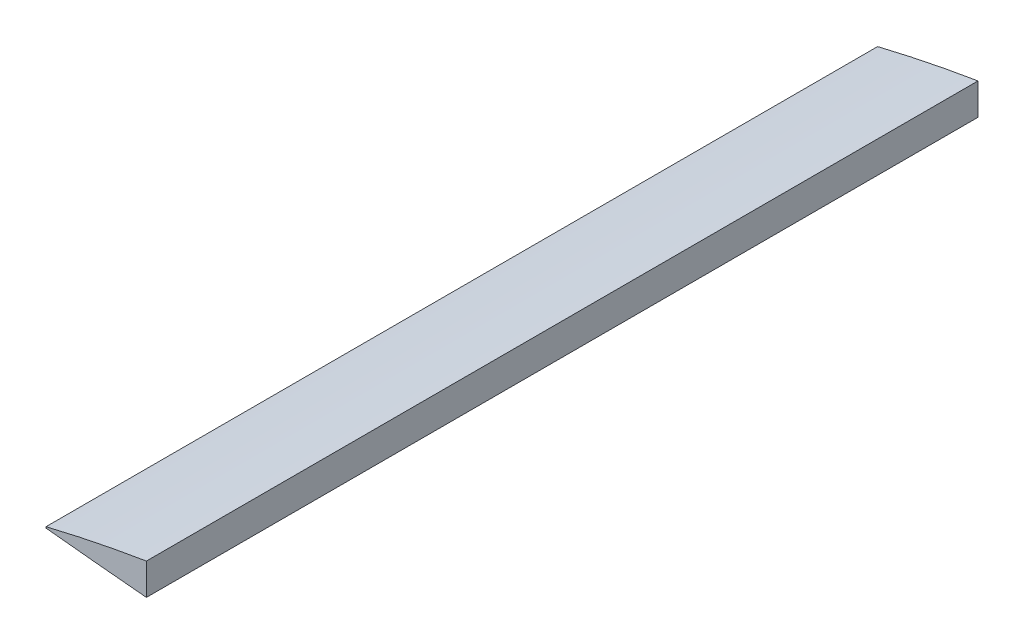
ISO-10303-21;
HEADER;
FILE_DESCRIPTION(('STEP AP214'),'2;1');
FILE_NAME('part.step','',(''),(''),'','','');
FILE_SCHEMA(('AUTOMOTIVE_DESIGN { 1 0 10303 214 1 1 1 1 }'));
ENDSEC;
DATA;
#1=APPLICATION_CONTEXT('core data for automotive mechanical design processes');
#2=APPLICATION_PROTOCOL_DEFINITION('international standard','automotive_design',2000,#1);
#3=PRODUCT_CONTEXT('',#1,'mechanical');
#4=PRODUCT('Part','Part','',(#3));
#5=PRODUCT_RELATED_PRODUCT_CATEGORY('part','',(#4));
#6=PRODUCT_DEFINITION_FORMATION('','',#4);
#7=PRODUCT_DEFINITION_CONTEXT('part definition',#1,'design');
#8=PRODUCT_DEFINITION('design','',#6,#7);
#9=PRODUCT_DEFINITION_SHAPE('','',#8);
#10=(LENGTH_UNIT() NAMED_UNIT(*) SI_UNIT(.MILLI.,.METRE.));
#11=(NAMED_UNIT(*) PLANE_ANGLE_UNIT() SI_UNIT($,.RADIAN.));
#12=(NAMED_UNIT(*) SI_UNIT($,.STERADIAN.) SOLID_ANGLE_UNIT());
#13=UNCERTAINTY_MEASURE_WITH_UNIT(LENGTH_MEASURE(1.E-05),#10,'distance_accuracy_value','');
#14=(GEOMETRIC_REPRESENTATION_CONTEXT(3) GLOBAL_UNCERTAINTY_ASSIGNED_CONTEXT((#13)) GLOBAL_UNIT_ASSIGNED_CONTEXT((#10,
#11,#12)) REPRESENTATION_CONTEXT('',''));
#15=CARTESIAN_POINT('',(0.,0.,0.));
#16=DIRECTION('',(0.,0.,1.));
#17=DIRECTION('',(1.,0.,0.));
#18=AXIS2_PLACEMENT_3D('',#15,#16,#17);
#19=CARTESIAN_POINT('',(-210.29024,15.5058314522249,-612.));
#20=CARTESIAN_POINT('',(-212.448163353275,15.1479340687311,-612.));
#21=CARTESIAN_POINT('',(-217.698820474475,14.2770984839323,-612.));
#22=CARTESIAN_POINT('',(-225.855056301461,12.8241428399332,-612.));
#23=CARTESIAN_POINT('',(-234.57385963361,11.2047682892585,-612.));
#24=CARTESIAN_POINT('',(-242.716368314428,9.61995396378064,-612.));
#25=CARTESIAN_POINT('',(-250.234652112608,8.09676921778001,-612.));
#26=CARTESIAN_POINT('',(-257.0840012335,6.6572410943926,-612.));
#27=CARTESIAN_POINT('',(-263.224123516304,5.32391997928555,-612.));
#28=CARTESIAN_POINT('',(-268.619097385422,4.11810915980885,-612.));
#29=CARTESIAN_POINT('',(-273.237578484398,3.05976006784548,-612.));
#30=CARTESIAN_POINT('',(-277.052897894547,2.16689109478463,-612.));
#31=CARTESIAN_POINT('',(-280.043162129704,1.45515688166644,-612.));
#32=CARTESIAN_POINT('',(-282.191276140311,0.937226777434344,-612.));
#33=CARTESIAN_POINT('',(-283.475130042903,0.625092250465188,-612.));
#34=CARTESIAN_POINT('',(-284.041595767765,0.486694399645982,-612.));
#35=CARTESIAN_POINT('',(-284.176,0.453857007963045,-612.));
#36=B_SPLINE_CURVE_WITH_KNOTS('',3,(#19,#20,#21,#22,#23,#24,#25,#26,#27,#28,#29,#30,#31,#32,#33,
#34,#35),.UNSPECIFIED.,.F.,.F.,(4,1,1,1,1,1,1,1,1,1,1,1,1,1,4),(0.,0.0870070051452901,
0.21170536500617,0.329527112719374,0.439740644540536,0.541660709078569,0.634652346186562,
0.718134668905483,0.791584505134145,0.854539888493236,0.906603358473801,0.947445002011979,
0.976805146454738,0.994496601743555,1.),.UNSPECIFIED.);
#37=DIRECTION('',(0.,0.,1.));
#38=VECTOR('',#37,1.);
#39=SURFACE_OF_LINEAR_EXTRUSION('',#36,#38);
#40=CARTESIAN_POINT('',(-210.29024,15.5058314522249,0.));
#41=CARTESIAN_POINT('',(-212.448163353275,15.1479340687311,0.));
#42=CARTESIAN_POINT('',(-217.698820474475,14.2770984839323,0.));
#43=CARTESIAN_POINT('',(-225.855056301461,12.8241428399332,0.));
#44=CARTESIAN_POINT('',(-234.57385963361,11.2047682892585,0.));
#45=CARTESIAN_POINT('',(-242.716368314428,9.61995396378064,0.));
#46=CARTESIAN_POINT('',(-250.234652112608,8.09676921778001,0.));
#47=CARTESIAN_POINT('',(-257.0840012335,6.6572410943926,0.));
#48=CARTESIAN_POINT('',(-263.224123516304,5.32391997928555,0.));
#49=CARTESIAN_POINT('',(-268.619097385422,4.11810915980885,0.));
#50=CARTESIAN_POINT('',(-273.237578484398,3.05976006784548,0.));
#51=CARTESIAN_POINT('',(-277.052897894547,2.16689109478463,0.));
#52=CARTESIAN_POINT('',(-280.043162129704,1.45515688166644,0.));
#53=CARTESIAN_POINT('',(-282.191276140311,0.937226777434344,0.));
#54=CARTESIAN_POINT('',(-283.475130042903,0.625092250465188,0.));
#55=CARTESIAN_POINT('',(-284.041595767765,0.486694399645982,0.));
#56=CARTESIAN_POINT('',(-284.176,0.453857007963045,0.));
#57=B_SPLINE_CURVE_WITH_KNOTS('',3,(#40,#41,#42,#43,#44,#45,#46,#47,#48,#49,#50,#51,#52,#53,#54,
#55,#56),.UNSPECIFIED.,.F.,.F.,(4,1,1,1,1,1,1,1,1,1,1,1,1,1,4),(0.,0.0870070051452901,
0.21170536500617,0.329527112719374,0.439740644540536,0.541660709078569,0.634652346186562,
0.718134668905483,0.791584505134145,0.854539888493236,0.906603358473801,0.947445002011979,
0.976805146454738,0.994496601743555,1.),.UNSPECIFIED.);
#58=CARTESIAN_POINT('',(-210.29024,15.5058314522249,0.));
#59=VERTEX_POINT('',#58);
#60=CARTESIAN_POINT('',(-284.176,0.453857007963045,0.));
#61=VERTEX_POINT('',#60);
#62=EDGE_CURVE('E133',#59,#61,#57,.T.);
#63=ORIENTED_EDGE('',*,*,#62,.F.);
#64=DIRECTION('',(0.,0.,1.));
#65=VECTOR('',#64,1.);
#66=CARTESIAN_POINT('',(-210.29024,15.5058314522249,-612.));
#67=LINE('',#66,#65);
#68=CARTESIAN_POINT('',(-210.29024,15.5058314522249,-612.));
#69=VERTEX_POINT('',#68);
#70=EDGE_CURVE('E65',#69,#59,#67,.T.);
#71=ORIENTED_EDGE('',*,*,#70,.F.);
#72=CARTESIAN_POINT('',(-284.176,0.453857007963045,-612.));
#73=VERTEX_POINT('',#72);
#74=EDGE_CURVE('E146',#69,#73,#36,.T.);
#75=ORIENTED_EDGE('',*,*,#74,.T.);
#76=DIRECTION('',(0.,0.,1.));
#77=VECTOR('',#76,1.);
#78=CARTESIAN_POINT('',(-284.176,0.453857007963045,-612.));
#79=LINE('',#78,#77);
#80=EDGE_CURVE('E91',#73,#61,#79,.T.);
#81=ORIENTED_EDGE('',*,*,#80,.T.);
#82=EDGE_LOOP('',(#63,#71,#75,#81));
#83=FACE_BOUND('',#82,.T.);
#84=ADVANCED_FACE('F39',(#83),#39,.T.);
#85=CARTESIAN_POINT('',(-210.29024,15.5058314522249,-612.));
#86=DIRECTION('',(1.,0.,0.));
#87=DIRECTION('',(0.,0.,-1.));
#88=AXIS2_PLACEMENT_3D('',#85,#86,#87);
#89=PLANE('',#88);
#90=DIRECTION('',(0.,1.,0.));
#91=VECTOR('',#90,1.);
#92=CARTESIAN_POINT('',(-210.29024,15.5058314522249,0.));
#93=LINE('',#92,#91);
#94=CARTESIAN_POINT('',(-210.29024,-7.68483164503255,0.));
#95=VERTEX_POINT('',#94);
#96=EDGE_CURVE('E152',#95,#59,#93,.T.);
#97=ORIENTED_EDGE('',*,*,#96,.F.);
#98=DIRECTION('',(0.,0.,1.));
#99=VECTOR('',#98,1.);
#100=CARTESIAN_POINT('',(-210.29024,-7.68483164503255,-612.));
#101=LINE('',#100,#99);
#102=CARTESIAN_POINT('',(-210.29024,-7.68483164503255,-612.));
#103=VERTEX_POINT('',#102);
#104=EDGE_CURVE('E204',#103,#95,#101,.T.);
#105=ORIENTED_EDGE('',*,*,#104,.F.);
#106=DIRECTION('',(0.,1.,0.));
#107=VECTOR('',#106,1.);
#108=CARTESIAN_POINT('',(-210.29024,15.5058314522249,-612.));
#109=LINE('',#108,#107);
#110=EDGE_CURVE('E163',#103,#69,#109,.T.);
#111=ORIENTED_EDGE('',*,*,#110,.T.);
#112=ORIENTED_EDGE('',*,*,#70,.T.);
#113=EDGE_LOOP('',(#97,#105,#111,#112));
#114=FACE_BOUND('',#113,.T.);
#115=ADVANCED_FACE('F173',(#114),#89,.T.);
#116=CARTESIAN_POINT('',(-284.176,-0.446585887155011,-612.));
#117=CARTESIAN_POINT('',(-284.166073983192,-0.446550556465792,-612.));
#118=CARTESIAN_POINT('',(-284.007600869438,-0.445986486865687,-612.));
#119=CARTESIAN_POINT('',(-283.409976300944,-0.546659804662299,-612.));
#120=CARTESIAN_POINT('',(-282.084971372146,-0.653321357836059,-612.));
#121=CARTESIAN_POINT('',(-279.890503933711,-0.906023665877273,-612.));
#122=CARTESIAN_POINT('',(-276.83669848881,-1.21907284104337,-612.));
#123=CARTESIAN_POINT('',(-272.945834405881,-1.6281931925168,-612.));
#124=CARTESIAN_POINT('',(-268.242600772352,-2.11178080190877,-612.));
#125=CARTESIAN_POINT('',(-262.758082865926,-2.67007960663762,-612.));
#126=CARTESIAN_POINT('',(-256.527861272268,-3.29477004091561,-612.));
#127=CARTESIAN_POINT('',(-249.592304466849,-3.98011450002054,-612.));
#128=CARTESIAN_POINT('',(-241.996045088026,-4.71925279025023,-612.));
#129=CARTESIAN_POINT('',(-233.787735511311,-5.50572775187703,-612.));
#130=CARTESIAN_POINT('',(-225.019553340548,-6.33168785215731,-612.));
#131=CARTESIAN_POINT('',(-217.124973788987,-7.06522307018421,-612.));
#132=CARTESIAN_POINT('',(-212.158655952302,-7.51544881591709,-612.));
#133=CARTESIAN_POINT('',(-210.29024,-7.68483164503255,-612.));
#134=B_SPLINE_CURVE_WITH_KNOTS('',3,(#116,#117,#118,#119,#120,#121,#122,#123,#124,#125,#126,
#127,#128,#129,#130,#131,#132,#133),.UNSPECIFIED.,.F.,.F.,(4,1,1,1,1,1,1,1,1,1,1,1,1,1,1,4),(0.,
0.000401027004237275,0.00640256804801398,0.0243667405419057,0.0541726551316402,
0.0956203448841406,0.148432949269866,0.212259606924723,0.286678920603446,0.371202853061501,
0.465280924763119,0.568304609739684,0.67961185947699,0.798491720853711,0.924189047970983,1.),.UNSPECIFIED.);
#135=DIRECTION('',(0.,0.,1.));
#136=VECTOR('',#135,1.);
#137=SURFACE_OF_LINEAR_EXTRUSION('',#134,#136);
#138=CARTESIAN_POINT('',(-284.176,-0.446585887155011,-83.8999999999999));
#139=CARTESIAN_POINT('',(-284.166073983192,-0.446550556465792,-83.8999999999999));
#140=CARTESIAN_POINT('',(-284.007600869438,-0.445986486865687,-83.8999999999999));
#141=CARTESIAN_POINT('',(-283.409976300944,-0.546659804662299,-83.8999999999999));
#142=CARTESIAN_POINT('',(-282.084971372146,-0.653321357836059,-83.8999999999999));
#143=CARTESIAN_POINT('',(-279.890503933711,-0.906023665877273,-83.8999999999999));
#144=CARTESIAN_POINT('',(-276.83669848881,-1.21907284104337,-83.8999999999999));
#145=CARTESIAN_POINT('',(-272.945834405881,-1.6281931925168,-83.8999999999999));
#146=CARTESIAN_POINT('',(-268.242600772352,-2.11178080190877,-83.8999999999999));
#147=CARTESIAN_POINT('',(-262.758082865926,-2.67007960663762,-83.8999999999999));
#148=CARTESIAN_POINT('',(-256.527861272268,-3.29477004091561,-83.8999999999999));
#149=CARTESIAN_POINT('',(-249.592304466849,-3.98011450002054,-83.8999999999999));
#150=CARTESIAN_POINT('',(-241.996045088026,-4.71925279025023,-83.8999999999999));
#151=CARTESIAN_POINT('',(-233.787735511311,-5.50572775187703,-83.8999999999999));
#152=CARTESIAN_POINT('',(-225.019553340548,-6.33168785215731,-83.8999999999999));
#153=CARTESIAN_POINT('',(-217.124973788987,-7.06522307018421,-83.8999999999999));
#154=CARTESIAN_POINT('',(-212.158655952302,-7.51544881591709,-83.8999999999999));
#155=CARTESIAN_POINT('',(-210.29024,-7.68483164503255,-83.8999999999999));
#156=B_SPLINE_CURVE_WITH_KNOTS('',3,(#138,#139,#140,#141,#142,#143,#144,#145,#146,#147,#148,
#149,#150,#151,#152,#153,#154,#155),.UNSPECIFIED.,.F.,.F.,(4,1,1,1,1,1,1,1,1,1,1,1,1,1,1,4),(0.,
0.000401027004237275,0.00640256804801398,0.0243667405419057,0.0541726551316402,
0.0956203448841406,0.148432949269866,0.212259606924723,0.286678920603446,0.371202853061501,
0.465280924763119,0.568304609739684,0.67961185947699,0.798491720853711,0.924189047970983,1.),.UNSPECIFIED.);
#157=CARTESIAN_POINT('',(-212.632,-7.47242156767323,-83.8999999999999));
#158=VERTEX_POINT('',#157);
#159=CARTESIAN_POINT('',(-233.632,-5.5182299496552,-83.8999999999999));
#160=VERTEX_POINT('',#159);
#161=EDGE_CURVE('E11',#158,#160,#156,.F.);
#162=ORIENTED_EDGE('',*,*,#161,.F.);
#163=DIRECTION('',(0.,0.,1.));
#164=VECTOR('',#163,1.);
#165=CARTESIAN_POINT('',(-212.632,-7.47242156767323,-612.));
#166=LINE('',#165,#164);
#167=CARTESIAN_POINT('',(-212.632,-7.47242156767323,-96.8999999999999));
#168=VERTEX_POINT('',#167);
#169=EDGE_CURVE('E121',#158,#168,#166,.F.);
#170=ORIENTED_EDGE('',*,*,#169,.T.);
#171=CARTESIAN_POINT('',(-284.176,-0.446585887155011,-96.9));
#172=CARTESIAN_POINT('',(-284.166073983192,-0.446550556465792,-96.9));
#173=CARTESIAN_POINT('',(-284.007600869438,-0.445986486865687,-96.9));
#174=CARTESIAN_POINT('',(-283.409976300944,-0.546659804662299,-96.9));
#175=CARTESIAN_POINT('',(-282.084971372146,-0.653321357836059,-96.9));
#176=CARTESIAN_POINT('',(-279.890503933711,-0.906023665877273,-96.9));
#177=CARTESIAN_POINT('',(-276.83669848881,-1.21907284104337,-96.9));
#178=CARTESIAN_POINT('',(-272.945834405881,-1.6281931925168,-96.9));
#179=CARTESIAN_POINT('',(-268.242600772352,-2.11178080190877,-96.9));
#180=CARTESIAN_POINT('',(-262.758082865926,-2.67007960663762,-96.9));
#181=CARTESIAN_POINT('',(-256.527861272268,-3.29477004091561,-96.9));
#182=CARTESIAN_POINT('',(-249.592304466849,-3.98011450002054,-96.9));
#183=CARTESIAN_POINT('',(-241.996045088026,-4.71925279025023,-96.9));
#184=CARTESIAN_POINT('',(-233.787735511311,-5.50572775187703,-96.9));
#185=CARTESIAN_POINT('',(-225.019553340548,-6.33168785215731,-96.9));
#186=CARTESIAN_POINT('',(-217.124973788987,-7.06522307018421,-96.9));
#187=CARTESIAN_POINT('',(-212.158655952302,-7.51544881591709,-96.9));
#188=CARTESIAN_POINT('',(-210.29024,-7.68483164503255,-96.9));
#189=B_SPLINE_CURVE_WITH_KNOTS('',3,(#171,#172,#173,#174,#175,#176,#177,#178,#179,#180,#181,
#182,#183,#184,#185,#186,#187,#188),.UNSPECIFIED.,.F.,.F.,(4,1,1,1,1,1,1,1,1,1,1,1,1,1,1,4),(0.,
0.000401027004237275,0.00640256804801398,0.0243667405419057,0.0541726551316402,
0.0956203448841406,0.148432949269866,0.212259606924723,0.286678920603446,0.371202853061501,
0.465280924763119,0.568304609739684,0.67961185947699,0.798491720853711,0.924189047970983,1.),.UNSPECIFIED.);
#190=CARTESIAN_POINT('',(-233.631999990573,-5.5182299496552,-96.9));
#191=VERTEX_POINT('',#190);
#192=EDGE_CURVE('E203',#168,#191,#189,.F.);
#193=ORIENTED_EDGE('',*,*,#192,.T.);
#194=DIRECTION('',(0.,0.,1.));
#195=VECTOR('',#194,1.);
#196=CARTESIAN_POINT('',(-233.632,-5.51822994875993,-612.));
#197=LINE('',#196,#195);
#198=EDGE_CURVE('E49',#191,#160,#197,.T.);
#199=ORIENTED_EDGE('',*,*,#198,.T.);
#200=EDGE_LOOP('',(#162,#170,#193,#199));
#201=FACE_BOUND('',#200,.T.);
#202=CARTESIAN_POINT('',(-284.176,-0.446585887155011,0.));
#203=CARTESIAN_POINT('',(-284.166073983192,-0.446550556465792,0.));
#204=CARTESIAN_POINT('',(-284.007600869438,-0.445986486865687,0.));
#205=CARTESIAN_POINT('',(-283.409976300944,-0.546659804662299,0.));
#206=CARTESIAN_POINT('',(-282.084971372146,-0.653321357836059,0.));
#207=CARTESIAN_POINT('',(-279.890503933711,-0.906023665877273,0.));
#208=CARTESIAN_POINT('',(-276.83669848881,-1.21907284104337,0.));
#209=CARTESIAN_POINT('',(-272.945834405881,-1.6281931925168,0.));
#210=CARTESIAN_POINT('',(-268.242600772352,-2.11178080190877,0.));
#211=CARTESIAN_POINT('',(-262.758082865926,-2.67007960663762,0.));
#212=CARTESIAN_POINT('',(-256.527861272268,-3.29477004091561,0.));
#213=CARTESIAN_POINT('',(-249.592304466849,-3.98011450002054,0.));
#214=CARTESIAN_POINT('',(-241.996045088026,-4.71925279025023,0.));
#215=CARTESIAN_POINT('',(-233.787735511311,-5.50572775187703,0.));
#216=CARTESIAN_POINT('',(-225.019553340548,-6.33168785215731,0.));
#217=CARTESIAN_POINT('',(-217.124973788987,-7.06522307018421,0.));
#218=CARTESIAN_POINT('',(-212.158655952302,-7.51544881591709,0.));
#219=CARTESIAN_POINT('',(-210.29024,-7.68483164503255,0.));
#220=B_SPLINE_CURVE_WITH_KNOTS('',3,(#202,#203,#204,#205,#206,#207,#208,#209,#210,#211,#212,
#213,#214,#215,#216,#217,#218,#219),.UNSPECIFIED.,.F.,.F.,(4,1,1,1,1,1,1,1,1,1,1,1,1,1,1,4),(0.,
0.000401027004237275,0.00640256804801398,0.0243667405419057,0.0541726551316402,
0.0956203448841406,0.148432949269866,0.212259606924723,0.286678920603446,0.371202853061501,
0.465280924763119,0.568304609739684,0.67961185947699,0.798491720853711,0.924189047970983,1.),.UNSPECIFIED.);
#221=CARTESIAN_POINT('',(-284.176,-0.446585887155011,0.));
#222=VERTEX_POINT('',#221);
#223=EDGE_CURVE('E195',#222,#95,#220,.T.);
#224=ORIENTED_EDGE('',*,*,#223,.F.);
#225=DIRECTION('',(0.,0.,1.));
#226=VECTOR('',#225,1.);
#227=CARTESIAN_POINT('',(-284.176,-0.446585887155011,-612.));
#228=LINE('',#227,#226);
#229=CARTESIAN_POINT('',(-284.176,-0.446585887155011,-612.));
#230=VERTEX_POINT('',#229);
#231=EDGE_CURVE('E206',#230,#222,#228,.T.);
#232=ORIENTED_EDGE('',*,*,#231,.F.);
#233=EDGE_CURVE('E157',#230,#103,#134,.T.);
#234=ORIENTED_EDGE('',*,*,#233,.T.);
#235=ORIENTED_EDGE('',*,*,#104,.T.);
#236=EDGE_LOOP('',(#224,#232,#234,#235));
#237=FACE_BOUND('',#236,.T.);
#238=ADVANCED_FACE('F169',(#201,#237),#137,.T.);
#239=CARTESIAN_POINT('',(-284.176,0.453857007963045,-612.));
#240=DIRECTION('',(-1.,0.,0.));
#241=DIRECTION('',(0.,0.,1.));
#242=AXIS2_PLACEMENT_3D('',#239,#240,#241);
#243=PLANE('',#242);
#244=DIRECTION('',(0.,-1.,0.));
#245=VECTOR('',#244,1.);
#246=CARTESIAN_POINT('',(-284.176,0.453857007963045,0.));
#247=LINE('',#246,#245);
#248=EDGE_CURVE('E192',#61,#222,#247,.T.);
#249=ORIENTED_EDGE('',*,*,#248,.F.);
#250=ORIENTED_EDGE('',*,*,#80,.F.);
#251=DIRECTION('',(0.,-1.,0.));
#252=VECTOR('',#251,1.);
#253=CARTESIAN_POINT('',(-284.176,0.453857007963045,-612.));
#254=LINE('',#253,#252);
#255=EDGE_CURVE('E151',#73,#230,#254,.T.);
#256=ORIENTED_EDGE('',*,*,#255,.T.);
#257=ORIENTED_EDGE('',*,*,#231,.T.);
#258=EDGE_LOOP('',(#249,#250,#256,#257));
#259=FACE_BOUND('',#258,.T.);
#260=ADVANCED_FACE('F172',(#259),#243,.T.);
#261=CARTESIAN_POINT('',(-247.374557249018,8.67350765840326,-612.));
#262=DIRECTION('',(0.,0.,-1.));
#263=DIRECTION('',(-1.,0.,0.));
#264=AXIS2_PLACEMENT_3D('',#261,#262,#263);
#265=PLANE('',#264);
#266=ORIENTED_EDGE('',*,*,#74,.F.);
#267=ORIENTED_EDGE('',*,*,#110,.F.);
#268=ORIENTED_EDGE('',*,*,#233,.F.);
#269=ORIENTED_EDGE('',*,*,#255,.F.);
#270=EDGE_LOOP('',(#266,#267,#268,#269));
#271=FACE_BOUND('',#270,.T.);
#272=ADVANCED_FACE('F177',(#271),#265,.T.);
#273=CARTESIAN_POINT('',(-247.374557249018,8.67350765840326,0.));
#274=DIRECTION('',(0.,0.,-1.));
#275=DIRECTION('',(-1.,0.,0.));
#276=AXIS2_PLACEMENT_3D('',#273,#274,#275);
#277=PLANE('',#276);
#278=ORIENTED_EDGE('',*,*,#62,.T.);
#279=ORIENTED_EDGE('',*,*,#248,.T.);
#280=ORIENTED_EDGE('',*,*,#223,.T.);
#281=ORIENTED_EDGE('',*,*,#96,.T.);
#282=EDGE_LOOP('',(#278,#279,#280,#281));
#283=FACE_BOUND('',#282,.T.);
#284=ADVANCED_FACE('F182',(#283),#277,.F.);
#285=CARTESIAN_POINT('',(-233.632,3.308,-83.8999999999999));
#286=DIRECTION('',(1.,0.,0.));
#287=DIRECTION('',(0.,0.,-1.));
#288=AXIS2_PLACEMENT_3D('',#285,#286,#287);
#289=PLANE('',#288);
#290=DIRECTION('',(0.,-1.,0.));
#291=VECTOR('',#290,1.);
#292=CARTESIAN_POINT('',(-233.632,3.308,-96.8999999999999));
#293=LINE('',#292,#291);
#294=CARTESIAN_POINT('',(-233.632,3.308,-96.8999999999999));
#295=VERTEX_POINT('',#294);
#296=EDGE_CURVE('E56',#295,#191,#293,.T.);
#297=ORIENTED_EDGE('',*,*,#296,.F.);
#298=DIRECTION('',(0.,0.,-1.));
#299=VECTOR('',#298,1.);
#300=CARTESIAN_POINT('',(-233.632,3.308,-83.8999999999999));
#301=LINE('',#300,#299);
#302=CARTESIAN_POINT('',(-233.632,3.308,-83.8999999999999));
#303=VERTEX_POINT('',#302);
#304=EDGE_CURVE('E134',#303,#295,#301,.T.);
#305=ORIENTED_EDGE('',*,*,#304,.F.);
#306=DIRECTION('',(0.,-1.,0.));
#307=VECTOR('',#306,1.);
#308=CARTESIAN_POINT('',(-233.632,3.308,-83.8999999999999));
#309=LINE('',#308,#307);
#310=EDGE_CURVE('E126',#303,#160,#309,.T.);
#311=ORIENTED_EDGE('',*,*,#310,.T.);
#312=ORIENTED_EDGE('',*,*,#198,.F.);
#313=EDGE_LOOP('',(#297,#305,#311,#312));
#314=FACE_BOUND('',#313,.T.);
#315=ADVANCED_FACE('F219',(#314),#289,.T.);
#316=CARTESIAN_POINT('',(-212.632,-8.192,-83.8999999999999));
#317=DIRECTION('',(-1.,0.,0.));
#318=DIRECTION('',(0.,0.,1.));
#319=AXIS2_PLACEMENT_3D('',#316,#317,#318);
#320=PLANE('',#319);
#321=DIRECTION('',(0.,1.,0.));
#322=VECTOR('',#321,1.);
#323=CARTESIAN_POINT('',(-212.632,-8.192,-83.8999999999999));
#324=LINE('',#323,#322);
#325=CARTESIAN_POINT('',(-212.632,3.308,-83.8999999999999));
#326=VERTEX_POINT('',#325);
#327=EDGE_CURVE('E114',#158,#326,#324,.T.);
#328=ORIENTED_EDGE('',*,*,#327,.T.);
#329=DIRECTION('',(0.,0.,-1.));
#330=VECTOR('',#329,1.);
#331=CARTESIAN_POINT('',(-212.632,3.308,-83.8999999999999));
#332=LINE('',#331,#330);
#333=CARTESIAN_POINT('',(-212.632,3.308,-96.8999999999999));
#334=VERTEX_POINT('',#333);
#335=EDGE_CURVE('E118',#326,#334,#332,.T.);
#336=ORIENTED_EDGE('',*,*,#335,.T.);
#337=DIRECTION('',(0.,1.,0.));
#338=VECTOR('',#337,1.);
#339=CARTESIAN_POINT('',(-212.632,-8.192,-96.8999999999999));
#340=LINE('',#339,#338);
#341=EDGE_CURVE('E144',#168,#334,#340,.T.);
#342=ORIENTED_EDGE('',*,*,#341,.F.);
#343=ORIENTED_EDGE('',*,*,#169,.F.);
#344=EDGE_LOOP('',(#328,#336,#342,#343));
#345=FACE_BOUND('',#344,.T.);
#346=ADVANCED_FACE('F116',(#345),#320,.T.);
#347=CARTESIAN_POINT('',(-212.632,3.308,-83.8999999999999));
#348=DIRECTION('',(0.,-1.,0.));
#349=DIRECTION('',(0.,0.,-1.));
#350=AXIS2_PLACEMENT_3D('',#347,#348,#349);
#351=PLANE('',#350);
#352=DIRECTION('',(-1.,0.,0.));
#353=VECTOR('',#352,1.);
#354=CARTESIAN_POINT('',(-212.632,3.308,-96.8999999999999));
#355=LINE('',#354,#353);
#356=EDGE_CURVE('E132',#334,#295,#355,.T.);
#357=ORIENTED_EDGE('',*,*,#356,.F.);
#358=ORIENTED_EDGE('',*,*,#335,.F.);
#359=DIRECTION('',(-1.,0.,0.));
#360=VECTOR('',#359,1.);
#361=CARTESIAN_POINT('',(-212.632,3.308,-83.8999999999999));
#362=LINE('',#361,#360);
#363=EDGE_CURVE('E125',#326,#303,#362,.T.);
#364=ORIENTED_EDGE('',*,*,#363,.T.);
#365=ORIENTED_EDGE('',*,*,#304,.T.);
#366=EDGE_LOOP('',(#357,#358,#364,#365));
#367=FACE_BOUND('',#366,.T.);
#368=ADVANCED_FACE('F129',(#367),#351,.T.);
#369=CARTESIAN_POINT('',(0.,0.,-83.8999999999999));
#370=DIRECTION('',(0.,0.,1.));
#371=DIRECTION('',(1.,0.,0.));
#372=AXIS2_PLACEMENT_3D('',#369,#370,#371);
#373=PLANE('',#372);
#374=ORIENTED_EDGE('',*,*,#161,.T.);
#375=ORIENTED_EDGE('',*,*,#310,.F.);
#376=ORIENTED_EDGE('',*,*,#363,.F.);
#377=ORIENTED_EDGE('',*,*,#327,.F.);
#378=EDGE_LOOP('',(#374,#375,#376,#377));
#379=FACE_BOUND('',#378,.T.);
#380=ADVANCED_FACE('F137',(#379),#373,.F.);
#381=CARTESIAN_POINT('',(0.,0.,-96.8999999999999));
#382=DIRECTION('',(0.,0.,1.));
#383=DIRECTION('',(1.,0.,0.));
#384=AXIS2_PLACEMENT_3D('',#381,#382,#383);
#385=PLANE('',#384);
#386=ORIENTED_EDGE('',*,*,#341,.T.);
#387=ORIENTED_EDGE('',*,*,#356,.T.);
#388=ORIENTED_EDGE('',*,*,#296,.T.);
#389=ORIENTED_EDGE('',*,*,#192,.F.);
#390=EDGE_LOOP('',(#386,#387,#388,#389));
#391=FACE_BOUND('',#390,.T.);
#392=ADVANCED_FACE('F230',(#391),#385,.T.);
#393=CLOSED_SHELL('',(#84,#115,#238,#260,#272,#284,#315,#346,#368,#380,#392));
#394=MANIFOLD_SOLID_BREP('B2',#393);
#395=ADVANCED_BREP_SHAPE_REPRESENTATION('',(#18,#394),#14);
#396=SHAPE_DEFINITION_REPRESENTATION(#9,#395);
ENDSEC;
END-ISO-10303-21;
